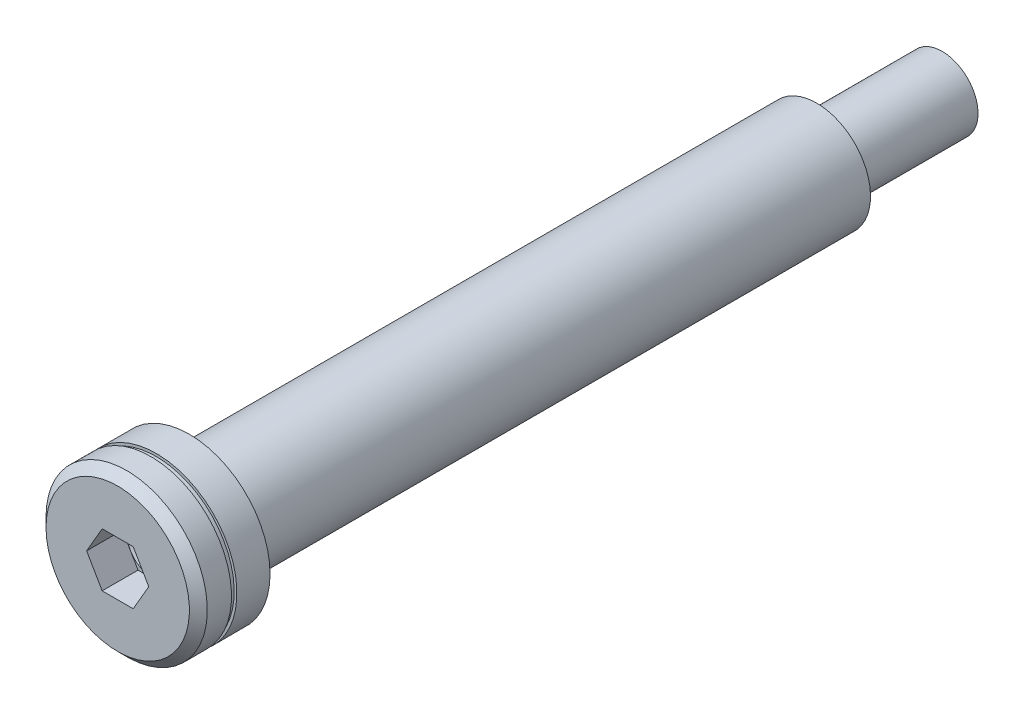
ISO-10303-21;
HEADER;
FILE_DESCRIPTION(('STEP AP214'),'2;1');
FILE_NAME('part.step','',(''),(''),'','','');
FILE_SCHEMA(('AUTOMOTIVE_DESIGN { 1 0 10303 214 1 1 1 1 }'));
ENDSEC;
DATA;
#1=APPLICATION_CONTEXT('core data for automotive mechanical design processes');
#2=APPLICATION_PROTOCOL_DEFINITION('international standard','automotive_design',2000,#1);
#3=PRODUCT_CONTEXT('',#1,'mechanical');
#4=PRODUCT('Part','Part','',(#3));
#5=PRODUCT_RELATED_PRODUCT_CATEGORY('part','',(#4));
#6=PRODUCT_DEFINITION_FORMATION('','',#4);
#7=PRODUCT_DEFINITION_CONTEXT('part definition',#1,'design');
#8=PRODUCT_DEFINITION('design','',#6,#7);
#9=PRODUCT_DEFINITION_SHAPE('','',#8);
#10=(LENGTH_UNIT() NAMED_UNIT(*) SI_UNIT(.MILLI.,.METRE.));
#11=(NAMED_UNIT(*) PLANE_ANGLE_UNIT() SI_UNIT($,.RADIAN.));
#12=(NAMED_UNIT(*) SI_UNIT($,.STERADIAN.) SOLID_ANGLE_UNIT());
#13=UNCERTAINTY_MEASURE_WITH_UNIT(LENGTH_MEASURE(1.E-05),#10,'distance_accuracy_value','');
#14=(GEOMETRIC_REPRESENTATION_CONTEXT(3) GLOBAL_UNCERTAINTY_ASSIGNED_CONTEXT((#13)) GLOBAL_UNIT_ASSIGNED_CONTEXT((#10,
#11,#12)) REPRESENTATION_CONTEXT('',''));
#15=CARTESIAN_POINT('',(0.,0.,0.));
#16=DIRECTION('',(0.,0.,1.));
#17=DIRECTION('',(1.,0.,0.));
#18=AXIS2_PLACEMENT_3D('',#15,#16,#17);
#19=CARTESIAN_POINT('',(0.,0.,0.));
#20=DIRECTION('',(0.,0.,-1.));
#21=DIRECTION('',(1.,0.,0.));
#22=AXIS2_PLACEMENT_3D('',#19,#20,#21);
#23=CONICAL_SURFACE('',#22,4.,0.785398163397449);
#24=CARTESIAN_POINT('',(0.,0.,0.));
#25=DIRECTION('',(0.,0.,-1.));
#26=DIRECTION('',(-1.,0.,0.));
#27=AXIS2_PLACEMENT_3D('',#24,#25,#26);
#28=CIRCLE('',#27,4.);
#29=CARTESIAN_POINT('',(-4.,0.,0.));
#30=VERTEX_POINT('',#29);
#31=EDGE_CURVE('E45',#30,#30,#28,.T.);
#32=ORIENTED_EDGE('',*,*,#31,.T.);
#33=EDGE_LOOP('',(#32));
#34=FACE_BOUND('',#33,.T.);
#35=CARTESIAN_POINT('',(0.,0.,-0.5));
#36=DIRECTION('',(0.,0.,1.));
#37=DIRECTION('',(-1.,0.,0.));
#38=AXIS2_PLACEMENT_3D('',#35,#36,#37);
#39=CIRCLE('',#38,4.5);
#40=CARTESIAN_POINT('',(-4.5,0.,-0.5));
#41=VERTEX_POINT('',#40);
#42=EDGE_CURVE('E11',#41,#41,#39,.T.);
#43=ORIENTED_EDGE('',*,*,#42,.T.);
#44=EDGE_LOOP('',(#43));
#45=FACE_BOUND('',#44,.T.);
#46=ADVANCED_FACE('F41',(#34,#45),#23,.T.);
#47=CARTESIAN_POINT('',(0.,0.,-4.));
#48=DIRECTION('',(0.,0.,1.));
#49=DIRECTION('',(-1.,0.,0.));
#50=AXIS2_PLACEMENT_3D('',#47,#48,#49);
#51=CYLINDRICAL_SURFACE('',#50,4.5);
#52=CARTESIAN_POINT('',(0.,0.,-1.85));
#53=DIRECTION('',(0.,0.,1.));
#54=DIRECTION('',(-1.,0.,0.));
#55=AXIS2_PLACEMENT_3D('',#52,#53,#54);
#56=CIRCLE('',#55,4.5);
#57=CARTESIAN_POINT('',(-4.5,0.,-1.85));
#58=VERTEX_POINT('',#57);
#59=EDGE_CURVE('E189',#58,#58,#56,.T.);
#60=ORIENTED_EDGE('',*,*,#59,.T.);
#61=EDGE_LOOP('',(#60));
#62=FACE_BOUND('',#61,.T.);
#63=ORIENTED_EDGE('',*,*,#42,.F.);
#64=EDGE_LOOP('',(#63));
#65=FACE_BOUND('',#64,.T.);
#66=ADVANCED_FACE('F279',(#62,#65),#51,.T.);
#67=CARTESIAN_POINT('',(0.,0.,0.));
#68=DIRECTION('',(0.,0.,1.));
#69=DIRECTION('',(0.,-1.,0.));
#70=AXIS2_PLACEMENT_3D('',#67,#68,#69);
#71=PLANE('',#70);
#72=DIRECTION('',(1.,0.,0.));
#73=VECTOR('',#72,1.);
#74=CARTESIAN_POINT('',(-0.866025403784437,1.5,0.));
#75=LINE('',#74,#73);
#76=CARTESIAN_POINT('',(-0.866025403784437,1.5,0.));
#77=VERTEX_POINT('',#76);
#78=CARTESIAN_POINT('',(0.866025403784438,1.5,0.));
#79=VERTEX_POINT('',#78);
#80=EDGE_CURVE('E225',#77,#79,#75,.T.);
#81=ORIENTED_EDGE('',*,*,#80,.T.);
#82=DIRECTION('',(0.5,-0.866025403784439,0.));
#83=VECTOR('',#82,1.);
#84=CARTESIAN_POINT('',(0.866025403784438,1.5,0.));
#85=LINE('',#84,#83);
#86=CARTESIAN_POINT('',(1.73205080756888,0.,0.));
#87=VERTEX_POINT('',#86);
#88=EDGE_CURVE('E154',#79,#87,#85,.T.);
#89=ORIENTED_EDGE('',*,*,#88,.T.);
#90=DIRECTION('',(-0.5,-0.866025403784439,0.));
#91=VECTOR('',#90,1.);
#92=CARTESIAN_POINT('',(1.73205080756888,0.,0.));
#93=LINE('',#92,#91);
#94=CARTESIAN_POINT('',(0.866025403784437,-1.5,0.));
#95=VERTEX_POINT('',#94);
#96=EDGE_CURVE('E132',#87,#95,#93,.T.);
#97=ORIENTED_EDGE('',*,*,#96,.T.);
#98=DIRECTION('',(-1.,0.,0.));
#99=VECTOR('',#98,1.);
#100=CARTESIAN_POINT('',(0.866025403784438,-1.5,0.));
#101=LINE('',#100,#99);
#102=CARTESIAN_POINT('',(-0.866025403784441,-1.5,0.));
#103=VERTEX_POINT('',#102);
#104=EDGE_CURVE('E140',#95,#103,#101,.T.);
#105=ORIENTED_EDGE('',*,*,#104,.T.);
#106=DIRECTION('',(-0.5,0.86602540378444,0.));
#107=VECTOR('',#106,1.);
#108=CARTESIAN_POINT('',(-0.866025403784441,-1.5,0.));
#109=LINE('',#108,#107);
#110=CARTESIAN_POINT('',(-1.73205080756888,0.,0.));
#111=VERTEX_POINT('',#110);
#112=EDGE_CURVE('E177',#103,#111,#109,.T.);
#113=ORIENTED_EDGE('',*,*,#112,.T.);
#114=DIRECTION('',(0.5,0.866025403784438,0.));
#115=VECTOR('',#114,1.);
#116=CARTESIAN_POINT('',(-1.73205080756888,0.,0.));
#117=LINE('',#116,#115);
#118=EDGE_CURVE('E202',#111,#77,#117,.T.);
#119=ORIENTED_EDGE('',*,*,#118,.T.);
#120=EDGE_LOOP('',(#81,#89,#97,#105,#113,#119));
#121=FACE_BOUND('',#120,.T.);
#122=ORIENTED_EDGE('',*,*,#31,.F.);
#123=EDGE_LOOP('',(#122));
#124=FACE_BOUND('',#123,.T.);
#125=ADVANCED_FACE('F151',(#121,#124),#71,.T.);
#126=CARTESIAN_POINT('',(-0.866025403784437,1.5,-2.));
#127=DIRECTION('',(0.,1.,0.));
#128=DIRECTION('',(1.,0.,0.));
#129=AXIS2_PLACEMENT_3D('',#126,#127,#128);
#130=PLANE('',#129);
#131=ORIENTED_EDGE('',*,*,#80,.F.);
#132=DIRECTION('',(0.,0.,1.));
#133=VECTOR('',#132,1.);
#134=CARTESIAN_POINT('',(-0.866025403784437,1.5,-2.));
#135=LINE('',#134,#133);
#136=CARTESIAN_POINT('',(-0.866025403784437,1.5,-2.));
#137=VERTEX_POINT('',#136);
#138=EDGE_CURVE('E205',#137,#77,#135,.T.);
#139=ORIENTED_EDGE('',*,*,#138,.F.);
#140=DIRECTION('',(1.,0.,0.));
#141=VECTOR('',#140,1.);
#142=CARTESIAN_POINT('',(-0.866025403784437,1.5,-2.));
#143=LINE('',#142,#141);
#144=CARTESIAN_POINT('',(0.,1.5,-2.));
#145=VERTEX_POINT('',#144);
#146=EDGE_CURVE('E167',#137,#145,#143,.T.);
#147=ORIENTED_EDGE('',*,*,#146,.T.);
#148=DIRECTION('',(1.,0.,0.));
#149=VECTOR('',#148,1.);
#150=CARTESIAN_POINT('',(-0.866025403784437,1.5,-2.));
#151=LINE('',#150,#149);
#152=CARTESIAN_POINT('',(0.866025403784438,1.5,-2.));
#153=VERTEX_POINT('',#152);
#154=EDGE_CURVE('E163',#145,#153,#151,.T.);
#155=ORIENTED_EDGE('',*,*,#154,.T.);
#156=DIRECTION('',(0.,0.,1.));
#157=VECTOR('',#156,1.);
#158=CARTESIAN_POINT('',(0.866025403784438,1.5,-2.));
#159=LINE('',#158,#157);
#160=EDGE_CURVE('E155',#153,#79,#159,.T.);
#161=ORIENTED_EDGE('',*,*,#160,.T.);
#162=EDGE_LOOP('',(#131,#139,#147,#155,#161));
#163=FACE_BOUND('',#162,.T.);
#164=ADVANCED_FACE('F305',(#163),#130,.F.);
#165=CARTESIAN_POINT('',(-1.73205080756888,0.,-2.));
#166=DIRECTION('',(-0.866025403784438,0.5,0.));
#167=DIRECTION('',(0.,0.,-1.));
#168=AXIS2_PLACEMENT_3D('',#165,#166,#167);
#169=PLANE('',#168);
#170=ORIENTED_EDGE('',*,*,#118,.F.);
#171=DIRECTION('',(0.,0.,1.));
#172=VECTOR('',#171,1.);
#173=CARTESIAN_POINT('',(-1.73205080756888,0.,-2.));
#174=LINE('',#173,#172);
#175=CARTESIAN_POINT('',(-1.73205080756888,0.,-2.));
#176=VERTEX_POINT('',#175);
#177=EDGE_CURVE('E179',#176,#111,#174,.T.);
#178=ORIENTED_EDGE('',*,*,#177,.F.);
#179=DIRECTION('',(0.5,0.866025403784438,0.));
#180=VECTOR('',#179,1.);
#181=CARTESIAN_POINT('',(-1.73205080756888,0.,-2.));
#182=LINE('',#181,#180);
#183=CARTESIAN_POINT('',(-1.29903810567666,0.75,-2.));
#184=VERTEX_POINT('',#183);
#185=EDGE_CURVE('E236',#176,#184,#182,.T.);
#186=ORIENTED_EDGE('',*,*,#185,.T.);
#187=DIRECTION('',(0.5,0.866025403784438,0.));
#188=VECTOR('',#187,1.);
#189=CARTESIAN_POINT('',(-1.73205080756888,0.,-2.));
#190=LINE('',#189,#188);
#191=EDGE_CURVE('E201',#184,#137,#190,.T.);
#192=ORIENTED_EDGE('',*,*,#191,.T.);
#193=ORIENTED_EDGE('',*,*,#138,.T.);
#194=EDGE_LOOP('',(#170,#178,#186,#192,#193));
#195=FACE_BOUND('',#194,.T.);
#196=ADVANCED_FACE('F299',(#195),#169,.F.);
#197=CARTESIAN_POINT('',(-0.866025403784441,-1.5,-2.));
#198=DIRECTION('',(-0.86602540378444,-0.5,0.));
#199=DIRECTION('',(-0.5,0.86602540378444,0.));
#200=AXIS2_PLACEMENT_3D('',#197,#198,#199);
#201=PLANE('',#200);
#202=ORIENTED_EDGE('',*,*,#112,.F.);
#203=DIRECTION('',(0.,0.,1.));
#204=VECTOR('',#203,1.);
#205=CARTESIAN_POINT('',(-0.866025403784441,-1.5,-2.));
#206=LINE('',#205,#204);
#207=CARTESIAN_POINT('',(-0.866025403784441,-1.5,-2.));
#208=VERTEX_POINT('',#207);
#209=EDGE_CURVE('E145',#208,#103,#206,.T.);
#210=ORIENTED_EDGE('',*,*,#209,.F.);
#211=DIRECTION('',(-0.5,0.86602540378444,0.));
#212=VECTOR('',#211,1.);
#213=CARTESIAN_POINT('',(-0.866025403784441,-1.5,-2.));
#214=LINE('',#213,#212);
#215=CARTESIAN_POINT('',(-1.29903810567666,-0.75,-2.));
#216=VERTEX_POINT('',#215);
#217=EDGE_CURVE('E161',#208,#216,#214,.T.);
#218=ORIENTED_EDGE('',*,*,#217,.T.);
#219=DIRECTION('',(-0.5,0.86602540378444,0.));
#220=VECTOR('',#219,1.);
#221=CARTESIAN_POINT('',(-0.866025403784441,-1.5,-2.));
#222=LINE('',#221,#220);
#223=EDGE_CURVE('E238',#216,#176,#222,.T.);
#224=ORIENTED_EDGE('',*,*,#223,.T.);
#225=ORIENTED_EDGE('',*,*,#177,.T.);
#226=EDGE_LOOP('',(#202,#210,#218,#224,#225));
#227=FACE_BOUND('',#226,.T.);
#228=ADVANCED_FACE('F296',(#227),#201,.F.);
#229=CARTESIAN_POINT('',(0.866025403784438,-1.5,-2.));
#230=DIRECTION('',(0.,-1.,0.));
#231=DIRECTION('',(-1.,0.,0.));
#232=AXIS2_PLACEMENT_3D('',#229,#230,#231);
#233=PLANE('',#232);
#234=ORIENTED_EDGE('',*,*,#104,.F.);
#235=DIRECTION('',(0.,0.,1.));
#236=VECTOR('',#235,1.);
#237=CARTESIAN_POINT('',(0.866025403784437,-1.5,-2.));
#238=LINE('',#237,#236);
#239=CARTESIAN_POINT('',(0.866025403784437,-1.5,-2.));
#240=VERTEX_POINT('',#239);
#241=EDGE_CURVE('E127',#240,#95,#238,.T.);
#242=ORIENTED_EDGE('',*,*,#241,.F.);
#243=DIRECTION('',(-1.,0.,0.));
#244=VECTOR('',#243,1.);
#245=CARTESIAN_POINT('',(0.866025403784438,-1.5,-2.));
#246=LINE('',#245,#244);
#247=CARTESIAN_POINT('',(0.,-1.5,-2.));
#248=VERTEX_POINT('',#247);
#249=EDGE_CURVE('E198',#240,#248,#246,.T.);
#250=ORIENTED_EDGE('',*,*,#249,.T.);
#251=DIRECTION('',(-1.,0.,0.));
#252=VECTOR('',#251,1.);
#253=CARTESIAN_POINT('',(0.866025403784438,-1.5,-2.));
#254=LINE('',#253,#252);
#255=EDGE_CURVE('E209',#248,#208,#254,.T.);
#256=ORIENTED_EDGE('',*,*,#255,.T.);
#257=ORIENTED_EDGE('',*,*,#209,.T.);
#258=EDGE_LOOP('',(#234,#242,#250,#256,#257));
#259=FACE_BOUND('',#258,.T.);
#260=ADVANCED_FACE('F143',(#259),#233,.F.);
#261=CARTESIAN_POINT('',(1.73205080756888,0.,-2.));
#262=DIRECTION('',(0.866025403784439,-0.5,0.));
#263=DIRECTION('',(0.,0.,1.));
#264=AXIS2_PLACEMENT_3D('',#261,#262,#263);
#265=PLANE('',#264);
#266=ORIENTED_EDGE('',*,*,#96,.F.);
#267=DIRECTION('',(0.,0.,1.));
#268=VECTOR('',#267,1.);
#269=CARTESIAN_POINT('',(1.73205080756888,0.,-2.));
#270=LINE('',#269,#268);
#271=CARTESIAN_POINT('',(1.73205080756888,0.,-2.));
#272=VERTEX_POINT('',#271);
#273=EDGE_CURVE('E157',#272,#87,#270,.T.);
#274=ORIENTED_EDGE('',*,*,#273,.F.);
#275=DIRECTION('',(-0.5,-0.866025403784439,0.));
#276=VECTOR('',#275,1.);
#277=CARTESIAN_POINT('',(1.73205080756888,0.,-2.));
#278=LINE('',#277,#276);
#279=CARTESIAN_POINT('',(1.29903810567666,-0.75,-2.));
#280=VERTEX_POINT('',#279);
#281=EDGE_CURVE('E174',#272,#280,#278,.T.);
#282=ORIENTED_EDGE('',*,*,#281,.T.);
#283=DIRECTION('',(-0.5,-0.866025403784439,0.));
#284=VECTOR('',#283,1.);
#285=CARTESIAN_POINT('',(1.73205080756888,0.,-2.));
#286=LINE('',#285,#284);
#287=EDGE_CURVE('E136',#280,#240,#286,.T.);
#288=ORIENTED_EDGE('',*,*,#287,.T.);
#289=ORIENTED_EDGE('',*,*,#241,.T.);
#290=EDGE_LOOP('',(#266,#274,#282,#288,#289));
#291=FACE_BOUND('',#290,.T.);
#292=ADVANCED_FACE('F129',(#291),#265,.F.);
#293=CARTESIAN_POINT('',(0.866025403784438,1.5,-2.));
#294=DIRECTION('',(0.866025403784439,0.5,0.));
#295=DIRECTION('',(0.,0.,1.));
#296=AXIS2_PLACEMENT_3D('',#293,#294,#295);
#297=PLANE('',#296);
#298=ORIENTED_EDGE('',*,*,#88,.F.);
#299=ORIENTED_EDGE('',*,*,#160,.F.);
#300=DIRECTION('',(0.5,-0.866025403784439,0.));
#301=VECTOR('',#300,1.);
#302=CARTESIAN_POINT('',(0.866025403784438,1.5,-2.));
#303=LINE('',#302,#301);
#304=CARTESIAN_POINT('',(1.29903810567666,0.75,-2.));
#305=VERTEX_POINT('',#304);
#306=EDGE_CURVE('E166',#153,#305,#303,.T.);
#307=ORIENTED_EDGE('',*,*,#306,.T.);
#308=DIRECTION('',(0.5,-0.866025403784439,0.));
#309=VECTOR('',#308,1.);
#310=CARTESIAN_POINT('',(0.866025403784438,1.5,-2.));
#311=LINE('',#310,#309);
#312=EDGE_CURVE('E172',#305,#272,#311,.T.);
#313=ORIENTED_EDGE('',*,*,#312,.T.);
#314=ORIENTED_EDGE('',*,*,#273,.T.);
#315=EDGE_LOOP('',(#298,#299,#307,#313,#314));
#316=FACE_BOUND('',#315,.T.);
#317=ADVANCED_FACE('F303',(#316),#297,.F.);
#318=CARTESIAN_POINT('',(0.,0.,-2.));
#319=DIRECTION('',(0.,0.,1.));
#320=DIRECTION('',(0.,-1.,0.));
#321=AXIS2_PLACEMENT_3D('',#318,#319,#320);
#322=PLANE('',#321);
#323=CARTESIAN_POINT('',(0.,0.,-2.));
#324=DIRECTION('',(0.,0.,-1.));
#325=DIRECTION('',(-1.,0.,0.));
#326=AXIS2_PLACEMENT_3D('',#323,#324,#325);
#327=CIRCLE('',#326,1.5);
#328=EDGE_CURVE('E185',#145,#305,#327,.T.);
#329=ORIENTED_EDGE('',*,*,#328,.T.);
#330=ORIENTED_EDGE('',*,*,#306,.F.);
#331=ORIENTED_EDGE('',*,*,#154,.F.);
#332=EDGE_LOOP('',(#329,#330,#331));
#333=FACE_BOUND('',#332,.T.);
#334=ADVANCED_FACE('F300',(#333),#322,.T.);
#335=CARTESIAN_POINT('',(0.,0.,-2.));
#336=DIRECTION('',(0.,0.,1.));
#337=DIRECTION('',(0.,-1.,0.));
#338=AXIS2_PLACEMENT_3D('',#335,#336,#337);
#339=PLANE('',#338);
#340=CARTESIAN_POINT('',(0.,0.,-2.));
#341=DIRECTION('',(0.,0.,-1.));
#342=DIRECTION('',(-1.,0.,0.));
#343=AXIS2_PLACEMENT_3D('',#340,#341,#342);
#344=CIRCLE('',#343,1.5);
#345=EDGE_CURVE('E183',#184,#145,#344,.T.);
#346=ORIENTED_EDGE('',*,*,#345,.T.);
#347=ORIENTED_EDGE('',*,*,#146,.F.);
#348=ORIENTED_EDGE('',*,*,#191,.F.);
#349=EDGE_LOOP('',(#346,#347,#348));
#350=FACE_BOUND('',#349,.T.);
#351=ADVANCED_FACE('F302',(#350),#339,.T.);
#352=CARTESIAN_POINT('',(0.,0.,-2.));
#353=DIRECTION('',(0.,0.,1.));
#354=DIRECTION('',(0.,-1.,0.));
#355=AXIS2_PLACEMENT_3D('',#352,#353,#354);
#356=PLANE('',#355);
#357=CARTESIAN_POINT('',(0.,0.,-2.));
#358=DIRECTION('',(0.,0.,-1.));
#359=DIRECTION('',(-1.,0.,0.));
#360=AXIS2_PLACEMENT_3D('',#357,#358,#359);
#361=CIRCLE('',#360,1.5);
#362=EDGE_CURVE('E186',#216,#184,#361,.T.);
#363=ORIENTED_EDGE('',*,*,#362,.T.);
#364=ORIENTED_EDGE('',*,*,#185,.F.);
#365=ORIENTED_EDGE('',*,*,#223,.F.);
#366=EDGE_LOOP('',(#363,#364,#365));
#367=FACE_BOUND('',#366,.T.);
#368=ADVANCED_FACE('F368',(#367),#356,.T.);
#369=CARTESIAN_POINT('',(0.,0.,-2.));
#370=DIRECTION('',(0.,0.,1.));
#371=DIRECTION('',(0.,-1.,0.));
#372=AXIS2_PLACEMENT_3D('',#369,#370,#371);
#373=PLANE('',#372);
#374=CARTESIAN_POINT('',(0.,0.,-2.));
#375=DIRECTION('',(0.,0.,-1.));
#376=DIRECTION('',(-1.,0.,0.));
#377=AXIS2_PLACEMENT_3D('',#374,#375,#376);
#378=CIRCLE('',#377,1.5);
#379=EDGE_CURVE('E196',#248,#216,#378,.T.);
#380=ORIENTED_EDGE('',*,*,#379,.T.);
#381=ORIENTED_EDGE('',*,*,#217,.F.);
#382=ORIENTED_EDGE('',*,*,#255,.F.);
#383=EDGE_LOOP('',(#380,#381,#382));
#384=FACE_BOUND('',#383,.T.);
#385=ADVANCED_FACE('F371',(#384),#373,.T.);
#386=CARTESIAN_POINT('',(0.,0.,-2.));
#387=DIRECTION('',(0.,0.,1.));
#388=DIRECTION('',(0.,-1.,0.));
#389=AXIS2_PLACEMENT_3D('',#386,#387,#388);
#390=PLANE('',#389);
#391=CARTESIAN_POINT('',(0.,0.,-2.));
#392=DIRECTION('',(0.,0.,1.));
#393=DIRECTION('',(0.,-1.,0.));
#394=AXIS2_PLACEMENT_3D('',#391,#392,#393);
#395=CIRCLE('',#394,1.5);
#396=EDGE_CURVE('E193',#248,#280,#395,.T.);
#397=ORIENTED_EDGE('',*,*,#396,.F.);
#398=ORIENTED_EDGE('',*,*,#249,.F.);
#399=ORIENTED_EDGE('',*,*,#287,.F.);
#400=EDGE_LOOP('',(#397,#398,#399));
#401=FACE_BOUND('',#400,.T.);
#402=ADVANCED_FACE('F294',(#401),#390,.T.);
#403=CARTESIAN_POINT('',(0.,0.,-2.));
#404=DIRECTION('',(0.,0.,1.));
#405=DIRECTION('',(0.,-1.,0.));
#406=AXIS2_PLACEMENT_3D('',#403,#404,#405);
#407=PLANE('',#406);
#408=CARTESIAN_POINT('',(0.,0.,-2.));
#409=DIRECTION('',(0.,0.,-1.));
#410=DIRECTION('',(-1.,0.,0.));
#411=AXIS2_PLACEMENT_3D('',#408,#409,#410);
#412=CIRCLE('',#411,1.5);
#413=EDGE_CURVE('E175',#305,#280,#412,.T.);
#414=ORIENTED_EDGE('',*,*,#413,.T.);
#415=ORIENTED_EDGE('',*,*,#281,.F.);
#416=ORIENTED_EDGE('',*,*,#312,.F.);
#417=EDGE_LOOP('',(#414,#415,#416));
#418=FACE_BOUND('',#417,.T.);
#419=ADVANCED_FACE('F290',(#418),#407,.T.);
#420=CARTESIAN_POINT('',(0.,0.,-2.));
#421=DIRECTION('',(0.,0.,1.));
#422=DIRECTION('',(0.,-1.,0.));
#423=AXIS2_PLACEMENT_3D('',#420,#421,#422);
#424=CONICAL_SURFACE('',#423,1.5,1.02974425867665);
#425=CARTESIAN_POINT('',(0.,0.,-2.90129092854134));
#426=VERTEX_POINT('',#425);
#427=VERTEX_LOOP('',#426);
#428=FACE_BOUND('',#427,.T.);
#429=ORIENTED_EDGE('',*,*,#396,.T.);
#430=ORIENTED_EDGE('',*,*,#413,.F.);
#431=ORIENTED_EDGE('',*,*,#328,.F.);
#432=ORIENTED_EDGE('',*,*,#345,.F.);
#433=ORIENTED_EDGE('',*,*,#362,.F.);
#434=ORIENTED_EDGE('',*,*,#379,.F.);
#435=EDGE_LOOP('',(#429,#430,#431,#432,#433,#434));
#436=FACE_BOUND('',#435,.T.);
#437=ADVANCED_FACE('F293',(#428,#436),#424,.F.);
#438=CARTESIAN_POINT('',(0.,-2.175,-2.15));
#439=DIRECTION('',(0.,0.,1.));
#440=DIRECTION('',(0.,-1.,0.));
#441=AXIS2_PLACEMENT_3D('',#438,#439,#440);
#442=PLANE('',#441);
#443=CARTESIAN_POINT('',(0.,0.,-2.15));
#444=DIRECTION('',(0.,0.,1.));
#445=DIRECTION('',(0.,-1.,0.));
#446=AXIS2_PLACEMENT_3D('',#443,#444,#445);
#447=CIRCLE('',#446,4.35);
#448=CARTESIAN_POINT('',(0.,-4.35,-2.15));
#449=VERTEX_POINT('',#448);
#450=EDGE_CURVE('E187',#449,#449,#447,.T.);
#451=ORIENTED_EDGE('',*,*,#450,.F.);
#452=EDGE_LOOP('',(#451));
#453=FACE_BOUND('',#452,.T.);
#454=CARTESIAN_POINT('',(0.,0.,-2.15));
#455=DIRECTION('',(0.,0.,1.));
#456=DIRECTION('',(-1.,0.,0.));
#457=AXIS2_PLACEMENT_3D('',#454,#455,#456);
#458=CIRCLE('',#457,4.5);
#459=CARTESIAN_POINT('',(-4.5,0.,-2.15));
#460=VERTEX_POINT('',#459);
#461=EDGE_CURVE('E171',#460,#460,#458,.T.);
#462=ORIENTED_EDGE('',*,*,#461,.T.);
#463=EDGE_LOOP('',(#462));
#464=FACE_BOUND('',#463,.T.);
#465=ADVANCED_FACE('F251',(#453,#464),#442,.T.);
#466=CARTESIAN_POINT('',(0.,-2.175,-1.85));
#467=DIRECTION('',(0.,0.,1.));
#468=DIRECTION('',(0.,-1.,0.));
#469=AXIS2_PLACEMENT_3D('',#466,#467,#468);
#470=PLANE('',#469);
#471=CARTESIAN_POINT('',(0.,0.,-1.85));
#472=DIRECTION('',(0.,0.,1.));
#473=DIRECTION('',(0.,-1.,0.));
#474=AXIS2_PLACEMENT_3D('',#471,#472,#473);
#475=CIRCLE('',#474,4.35);
#476=CARTESIAN_POINT('',(0.,-4.35,-1.85));
#477=VERTEX_POINT('',#476);
#478=EDGE_CURVE('E190',#477,#477,#475,.T.);
#479=ORIENTED_EDGE('',*,*,#478,.T.);
#480=EDGE_LOOP('',(#479));
#481=FACE_BOUND('',#480,.T.);
#482=ORIENTED_EDGE('',*,*,#59,.F.);
#483=EDGE_LOOP('',(#482));
#484=FACE_BOUND('',#483,.T.);
#485=ADVANCED_FACE('F339',(#481,#484),#470,.F.);
#486=CARTESIAN_POINT('',(0.,0.,-1.85));
#487=DIRECTION('',(0.,0.,-1.));
#488=DIRECTION('',(1.,0.,0.));
#489=AXIS2_PLACEMENT_3D('',#486,#487,#488);
#490=CYLINDRICAL_SURFACE('',#489,4.35);
#491=ORIENTED_EDGE('',*,*,#450,.T.);
#492=EDGE_LOOP('',(#491));
#493=FACE_BOUND('',#492,.T.);
#494=ORIENTED_EDGE('',*,*,#478,.F.);
#495=EDGE_LOOP('',(#494));
#496=FACE_BOUND('',#495,.T.);
#497=ADVANCED_FACE('F342',(#493,#496),#490,.T.);
#498=CARTESIAN_POINT('',(0.,0.,-39.));
#499=DIRECTION('',(0.,0.,1.));
#500=DIRECTION('',(-1.,0.,0.));
#501=AXIS2_PLACEMENT_3D('',#498,#499,#500);
#502=CYLINDRICAL_SURFACE('',#501,3.);
#503=CARTESIAN_POINT('',(0.,0.,-4.58413056717129));
#504=DIRECTION('',(0.,0.,1.));
#505=DIRECTION('',(1.,0.,0.));
#506=AXIS2_PLACEMENT_3D('',#503,#504,#505);
#507=CIRCLE('',#506,3.);
#508=CARTESIAN_POINT('',(3.,0.,-4.58413056717129));
#509=VERTEX_POINT('',#508);
#510=EDGE_CURVE('E215',#509,#509,#507,.T.);
#511=ORIENTED_EDGE('',*,*,#510,.F.);
#512=EDGE_LOOP('',(#511));
#513=FACE_BOUND('',#512,.T.);
#514=CARTESIAN_POINT('',(0.,0.,-39.));
#515=DIRECTION('',(0.,0.,-1.));
#516=DIRECTION('',(0.,-1.,0.));
#517=AXIS2_PLACEMENT_3D('',#514,#515,#516);
#518=CIRCLE('',#517,3.);
#519=CARTESIAN_POINT('',(0.,-3.,-39.));
#520=VERTEX_POINT('',#519);
#521=EDGE_CURVE('E213',#520,#520,#518,.T.);
#522=ORIENTED_EDGE('',*,*,#521,.F.);
#523=EDGE_LOOP('',(#522));
#524=FACE_BOUND('',#523,.T.);
#525=ADVANCED_FACE('F344',(#513,#524),#502,.T.);
#526=CARTESIAN_POINT('',(0.,0.,-39.));
#527=DIRECTION('',(0.,0.,1.));
#528=DIRECTION('',(0.,-1.,0.));
#529=AXIS2_PLACEMENT_3D('',#526,#527,#528);
#530=PLANE('',#529);
#531=ORIENTED_EDGE('',*,*,#521,.T.);
#532=EDGE_LOOP('',(#531));
#533=FACE_BOUND('',#532,.T.);
#534=CARTESIAN_POINT('',(0.,0.,-39.));
#535=DIRECTION('',(0.,0.,-1.));
#536=DIRECTION('',(0.,-1.,0.));
#537=AXIS2_PLACEMENT_3D('',#534,#535,#536);
#538=CIRCLE('',#537,2.);
#539=CARTESIAN_POINT('',(0.,-2.,-39.));
#540=VERTEX_POINT('',#539);
#541=EDGE_CURVE('E219',#540,#540,#538,.T.);
#542=ORIENTED_EDGE('',*,*,#541,.F.);
#543=EDGE_LOOP('',(#542));
#544=FACE_BOUND('',#543,.T.);
#545=ADVANCED_FACE('F351',(#533,#544),#530,.F.);
#546=CARTESIAN_POINT('',(0.,0.,-46.));
#547=DIRECTION('',(0.,0.,1.));
#548=DIRECTION('',(-1.,0.,0.));
#549=AXIS2_PLACEMENT_3D('',#546,#547,#548);
#550=CYLINDRICAL_SURFACE('',#549,2.);
#551=ORIENTED_EDGE('',*,*,#541,.T.);
#552=EDGE_LOOP('',(#551));
#553=FACE_BOUND('',#552,.T.);
#554=CARTESIAN_POINT('',(0.,0.,-39.5));
#555=DIRECTION('',(0.,0.,1.));
#556=DIRECTION('',(-1.,0.,0.));
#557=AXIS2_PLACEMENT_3D('',#554,#555,#556);
#558=CIRCLE('',#557,2.);
#559=CARTESIAN_POINT('',(-2.,0.,-39.5));
#560=VERTEX_POINT('',#559);
#561=EDGE_CURVE('E221',#560,#560,#558,.T.);
#562=ORIENTED_EDGE('',*,*,#561,.T.);
#563=EDGE_LOOP('',(#562));
#564=FACE_BOUND('',#563,.T.);
#565=ADVANCED_FACE('F43',(#553,#564),#550,.T.);
#566=CARTESIAN_POINT('',(0.,0.,-46.));
#567=DIRECTION('',(0.,0.,1.));
#568=DIRECTION('',(-1.,0.,0.));
#569=AXIS2_PLACEMENT_3D('',#566,#567,#568);
#570=CYLINDRICAL_SURFACE('',#569,2.);
#571=ORIENTED_EDGE('',*,*,#561,.F.);
#572=EDGE_LOOP('',(#571));
#573=FACE_BOUND('',#572,.T.);
#574=CARTESIAN_POINT('',(0.,0.,-46.));
#575=DIRECTION('',(0.,0.,-1.));
#576=DIRECTION('',(0.,-1.,0.));
#577=AXIS2_PLACEMENT_3D('',#574,#575,#576);
#578=CIRCLE('',#577,2.);
#579=CARTESIAN_POINT('',(0.,-2.,-46.));
#580=VERTEX_POINT('',#579);
#581=EDGE_CURVE('E217',#580,#580,#578,.T.);
#582=ORIENTED_EDGE('',*,*,#581,.F.);
#583=EDGE_LOOP('',(#582));
#584=FACE_BOUND('',#583,.T.);
#585=ADVANCED_FACE('F274',(#573,#584),#570,.T.);
#586=CARTESIAN_POINT('',(0.,0.,-46.));
#587=DIRECTION('',(0.,0.,1.));
#588=DIRECTION('',(0.,-1.,0.));
#589=AXIS2_PLACEMENT_3D('',#586,#587,#588);
#590=PLANE('',#589);
#591=ORIENTED_EDGE('',*,*,#581,.T.);
#592=EDGE_LOOP('',(#591));
#593=FACE_BOUND('',#592,.T.);
#594=ADVANCED_FACE('F268',(#593),#590,.F.);
#595=CARTESIAN_POINT('',(0.,0.,-4.29206528358564));
#596=DIRECTION('',(0.,0.,-1.));
#597=DIRECTION('',(1.,0.,0.));
#598=AXIS2_PLACEMENT_3D('',#595,#596,#597);
#599=TOROIDAL_SURFACE('',#598,3.,0.292065283585645);
#600=ORIENTED_EDGE('',*,*,#510,.T.);
#601=EDGE_LOOP('',(#600));
#602=FACE_BOUND('',#601,.T.);
#603=CARTESIAN_POINT('',(0.,0.,-4.));
#604=DIRECTION('',(0.,0.,-1.));
#605=DIRECTION('',(0.,-1.,0.));
#606=AXIS2_PLACEMENT_3D('',#603,#604,#605);
#607=CIRCLE('',#606,3.);
#608=CARTESIAN_POINT('',(0.,-3.,-4.));
#609=VERTEX_POINT('',#608);
#610=EDGE_CURVE('E218',#609,#609,#607,.T.);
#611=ORIENTED_EDGE('',*,*,#610,.T.);
#612=EDGE_LOOP('',(#611));
#613=FACE_BOUND('',#612,.T.);
#614=ADVANCED_FACE('F262',(#602,#613),#599,.F.);
#615=CARTESIAN_POINT('',(0.,0.,-4.));
#616=DIRECTION('',(0.,0.,1.));
#617=DIRECTION('',(0.,-1.,0.));
#618=AXIS2_PLACEMENT_3D('',#615,#616,#617);
#619=PLANE('',#618);
#620=CARTESIAN_POINT('',(0.,0.,-4.));
#621=DIRECTION('',(0.,0.,-1.));
#622=DIRECTION('',(1.,0.,0.));
#623=AXIS2_PLACEMENT_3D('',#620,#621,#622);
#624=CIRCLE('',#623,4.5);
#625=CARTESIAN_POINT('',(4.5,0.,-4.));
#626=VERTEX_POINT('',#625);
#627=EDGE_CURVE('E169',#626,#626,#624,.T.);
#628=ORIENTED_EDGE('',*,*,#627,.T.);
#629=EDGE_LOOP('',(#628));
#630=FACE_BOUND('',#629,.T.);
#631=ORIENTED_EDGE('',*,*,#610,.F.);
#632=EDGE_LOOP('',(#631));
#633=FACE_BOUND('',#632,.T.);
#634=ADVANCED_FACE('F256',(#630,#633),#619,.F.);
#635=CARTESIAN_POINT('',(0.,0.,-4.));
#636=DIRECTION('',(0.,0.,1.));
#637=DIRECTION('',(-1.,0.,0.));
#638=AXIS2_PLACEMENT_3D('',#635,#636,#637);
#639=CYLINDRICAL_SURFACE('',#638,4.5);
#640=ORIENTED_EDGE('',*,*,#461,.F.);
#641=EDGE_LOOP('',(#640));
#642=FACE_BOUND('',#641,.T.);
#643=ORIENTED_EDGE('',*,*,#627,.F.);
#644=EDGE_LOOP('',(#643));
#645=FACE_BOUND('',#644,.T.);
#646=ADVANCED_FACE('F253',(#642,#645),#639,.T.);
#647=CLOSED_SHELL('',(#46,#66,#125,#164,#196,#228,#260,#292,#317,#334,#351,#368,#385,#402,#419,
#437,#465,#485,#497,#525,#545,#565,#585,#594,#614,#634,#646));
#648=MANIFOLD_SOLID_BREP('B2',#647);
#649=ADVANCED_BREP_SHAPE_REPRESENTATION('',(#18,#648),#14);
#650=SHAPE_DEFINITION_REPRESENTATION(#9,#649);
ENDSEC;
END-ISO-10303-21;
